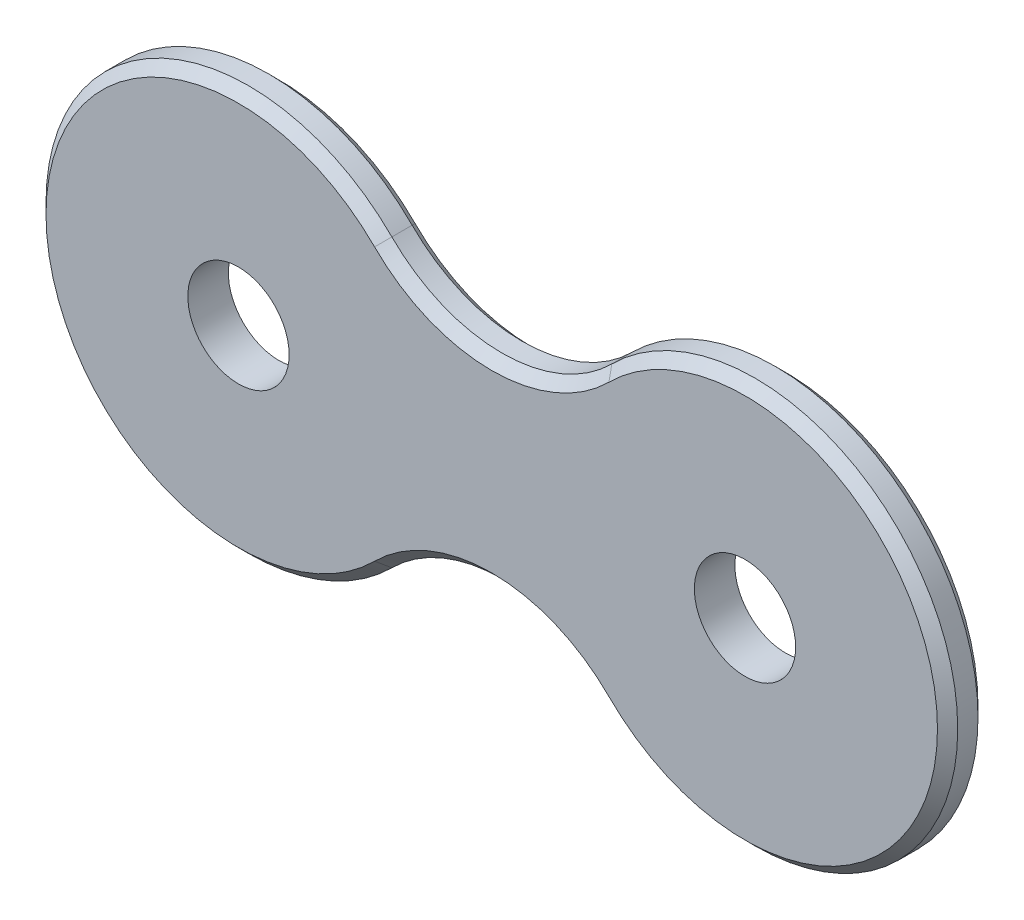
ISO-10303-21;
HEADER;
FILE_DESCRIPTION(('STEP AP214'),'2;1');
FILE_NAME('part.step','',(''),(''),'','','');
FILE_SCHEMA(('AUTOMOTIVE_DESIGN { 1 0 10303 214 1 1 1 1 }'));
ENDSEC;
DATA;
#1=APPLICATION_CONTEXT('core data for automotive mechanical design processes');
#2=APPLICATION_PROTOCOL_DEFINITION('international standard','automotive_design',2000,#1);
#3=PRODUCT_CONTEXT('',#1,'mechanical');
#4=PRODUCT('Part','Part','',(#3));
#5=PRODUCT_RELATED_PRODUCT_CATEGORY('part','',(#4));
#6=PRODUCT_DEFINITION_FORMATION('','',#4);
#7=PRODUCT_DEFINITION_CONTEXT('part definition',#1,'design');
#8=PRODUCT_DEFINITION('design','',#6,#7);
#9=PRODUCT_DEFINITION_SHAPE('','',#8);
#10=(LENGTH_UNIT() NAMED_UNIT(*) SI_UNIT(.MILLI.,.METRE.));
#11=(NAMED_UNIT(*) PLANE_ANGLE_UNIT() SI_UNIT($,.RADIAN.));
#12=(NAMED_UNIT(*) SI_UNIT($,.STERADIAN.) SOLID_ANGLE_UNIT());
#13=UNCERTAINTY_MEASURE_WITH_UNIT(LENGTH_MEASURE(1.E-05),#10,'distance_accuracy_value','');
#14=(GEOMETRIC_REPRESENTATION_CONTEXT(3) GLOBAL_UNCERTAINTY_ASSIGNED_CONTEXT((#13)) GLOBAL_UNIT_ASSIGNED_CONTEXT((#10,
#11,#12)) REPRESENTATION_CONTEXT('',''));
#15=CARTESIAN_POINT('',(0.,0.,0.));
#16=DIRECTION('',(0.,0.,1.));
#17=DIRECTION('',(1.,0.,0.));
#18=AXIS2_PLACEMENT_3D('',#15,#16,#17);
#19=CARTESIAN_POINT('',(18.75,6.25,2.));
#20=DIRECTION('',(0.,0.,1.));
#21=DIRECTION('',(1.,0.,0.));
#22=AXIS2_PLACEMENT_3D('',#19,#20,#21);
#23=PLANE('',#22);
#24=CARTESIAN_POINT('',(12.5,-12.5,2.));
#25=DIRECTION('',(0.,0.,1.));
#26=DIRECTION('',(1.,0.,0.));
#27=AXIS2_PLACEMENT_3D('',#24,#25,#26);
#28=CIRCLE('',#27,8.17766952966369);
#29=CARTESIAN_POINT('',(6.7175144212722,-6.7175144212722,2.));
#30=VERTEX_POINT('',#29);
#31=CARTESIAN_POINT('',(18.2824855787278,-6.7175144212722,2.));
#32=VERTEX_POINT('',#31);
#33=EDGE_CURVE('E72',#30,#32,#28,.F.);
#34=ORIENTED_EDGE('',*,*,#33,.T.);
#35=CARTESIAN_POINT('',(25.,0.,2.));
#36=DIRECTION('',(0.,0.,1.));
#37=DIRECTION('',(1.,0.,0.));
#38=AXIS2_PLACEMENT_3D('',#35,#36,#37);
#39=CIRCLE('',#38,9.49999999999999);
#40=CARTESIAN_POINT('',(18.2824855787278,6.7175144212722,2.));
#41=VERTEX_POINT('',#40);
#42=EDGE_CURVE('E12',#32,#41,#39,.T.);
#43=ORIENTED_EDGE('',*,*,#42,.T.);
#44=CARTESIAN_POINT('',(12.5,12.5,2.));
#45=DIRECTION('',(0.,0.,1.));
#46=DIRECTION('',(1.,0.,0.));
#47=AXIS2_PLACEMENT_3D('',#44,#45,#46);
#48=CIRCLE('',#47,8.17766952966369);
#49=CARTESIAN_POINT('',(6.7175144212722,6.7175144212722,2.));
#50=VERTEX_POINT('',#49);
#51=EDGE_CURVE('E179',#41,#50,#48,.F.);
#52=ORIENTED_EDGE('',*,*,#51,.T.);
#53=CARTESIAN_POINT('',(0.,0.,2.));
#54=DIRECTION('',(0.,0.,1.));
#55=DIRECTION('',(1.,0.,0.));
#56=AXIS2_PLACEMENT_3D('',#53,#54,#55);
#57=CIRCLE('',#56,9.49999999999999);
#58=EDGE_CURVE('E83',#50,#30,#57,.T.);
#59=ORIENTED_EDGE('',*,*,#58,.T.);
#60=EDGE_LOOP('',(#34,#43,#52,#59));
#61=FACE_BOUND('',#60,.T.);
#62=CARTESIAN_POINT('',(0.,0.,2.));
#63=DIRECTION('',(0.,0.,1.));
#64=DIRECTION('',(1.,0.,0.));
#65=AXIS2_PLACEMENT_3D('',#62,#63,#64);
#66=CIRCLE('',#65,2.5);
#67=CARTESIAN_POINT('',(2.5,0.,2.));
#68=VERTEX_POINT('',#67);
#69=EDGE_CURVE('E204',#68,#68,#66,.T.);
#70=ORIENTED_EDGE('',*,*,#69,.F.);
#71=EDGE_LOOP('',(#70));
#72=FACE_BOUND('',#71,.T.);
#73=CARTESIAN_POINT('',(25.,0.,2.));
#74=DIRECTION('',(0.,0.,1.));
#75=DIRECTION('',(1.,0.,0.));
#76=AXIS2_PLACEMENT_3D('',#73,#74,#75);
#77=CIRCLE('',#76,2.5);
#78=CARTESIAN_POINT('',(27.5,0.,2.));
#79=VERTEX_POINT('',#78);
#80=EDGE_CURVE('E215',#79,#79,#77,.T.);
#81=ORIENTED_EDGE('',*,*,#80,.F.);
#82=EDGE_LOOP('',(#81));
#83=FACE_BOUND('',#82,.T.);
#84=ADVANCED_FACE('F63',(#61,#72,#83),#23,.T.);
#85=CARTESIAN_POINT('',(18.75,6.25,0.));
#86=DIRECTION('',(0.,0.,1.));
#87=DIRECTION('',(1.,0.,0.));
#88=AXIS2_PLACEMENT_3D('',#85,#86,#87);
#89=PLANE('',#88);
#90=CARTESIAN_POINT('',(25.,0.,0.));
#91=DIRECTION('',(0.,0.,1.));
#92=DIRECTION('',(1.,0.,0.));
#93=AXIS2_PLACEMENT_3D('',#90,#91,#92);
#94=CIRCLE('',#93,9.5);
#95=CARTESIAN_POINT('',(18.2824855787278,6.71751442127221,0.));
#96=VERTEX_POINT('',#95);
#97=CARTESIAN_POINT('',(18.2824855787278,-6.7175144212722,0.));
#98=VERTEX_POINT('',#97);
#99=EDGE_CURVE('E139',#96,#98,#94,.F.);
#100=ORIENTED_EDGE('',*,*,#99,.T.);
#101=CARTESIAN_POINT('',(12.5,-12.5,0.));
#102=DIRECTION('',(0.,0.,1.));
#103=DIRECTION('',(1.,0.,0.));
#104=AXIS2_PLACEMENT_3D('',#101,#102,#103);
#105=CIRCLE('',#104,8.17766952966369);
#106=CARTESIAN_POINT('',(6.7175144212722,-6.7175144212722,0.));
#107=VERTEX_POINT('',#106);
#108=EDGE_CURVE('E135',#98,#107,#105,.T.);
#109=ORIENTED_EDGE('',*,*,#108,.T.);
#110=CARTESIAN_POINT('',(0.,0.,0.));
#111=DIRECTION('',(0.,0.,1.));
#112=DIRECTION('',(1.,0.,0.));
#113=AXIS2_PLACEMENT_3D('',#110,#111,#112);
#114=CIRCLE('',#113,9.5);
#115=CARTESIAN_POINT('',(6.7175144212722,6.7175144212722,0.));
#116=VERTEX_POINT('',#115);
#117=EDGE_CURVE('E128',#107,#116,#114,.F.);
#118=ORIENTED_EDGE('',*,*,#117,.T.);
#119=CARTESIAN_POINT('',(12.5,12.5,0.));
#120=DIRECTION('',(0.,0.,1.));
#121=DIRECTION('',(1.,0.,0.));
#122=AXIS2_PLACEMENT_3D('',#119,#120,#121);
#123=CIRCLE('',#122,8.17766952966369);
#124=EDGE_CURVE('E132',#116,#96,#123,.T.);
#125=ORIENTED_EDGE('',*,*,#124,.T.);
#126=EDGE_LOOP('',(#100,#109,#118,#125));
#127=FACE_BOUND('',#126,.T.);
#128=CARTESIAN_POINT('',(0.,0.,0.));
#129=DIRECTION('',(0.,0.,1.));
#130=DIRECTION('',(1.,0.,0.));
#131=AXIS2_PLACEMENT_3D('',#128,#129,#130);
#132=CIRCLE('',#131,2.5);
#133=CARTESIAN_POINT('',(2.5,0.,0.));
#134=VERTEX_POINT('',#133);
#135=EDGE_CURVE('E212',#134,#134,#132,.T.);
#136=ORIENTED_EDGE('',*,*,#135,.T.);
#137=EDGE_LOOP('',(#136));
#138=FACE_BOUND('',#137,.T.);
#139=CARTESIAN_POINT('',(25.,0.,0.));
#140=DIRECTION('',(0.,0.,1.));
#141=DIRECTION('',(1.,0.,0.));
#142=AXIS2_PLACEMENT_3D('',#139,#140,#141);
#143=CIRCLE('',#142,2.5);
#144=CARTESIAN_POINT('',(27.5,0.,0.));
#145=VERTEX_POINT('',#144);
#146=EDGE_CURVE('E156',#145,#145,#143,.T.);
#147=ORIENTED_EDGE('',*,*,#146,.T.);
#148=EDGE_LOOP('',(#147));
#149=FACE_BOUND('',#148,.T.);
#150=ADVANCED_FACE('F130',(#127,#138,#149),#89,.F.);
#151=CARTESIAN_POINT('',(12.5,12.5,2.));
#152=DIRECTION('',(0.,0.,-1.));
#153=DIRECTION('',(-1.,0.,0.));
#154=AXIS2_PLACEMENT_3D('',#151,#152,#153);
#155=CYLINDRICAL_SURFACE('',#154,7.67766952966369);
#156=DIRECTION('',(0.,0.,-1.));
#157=VECTOR('',#156,1.);
#158=CARTESIAN_POINT('',(17.9289321881345,7.07106781186548,2.));
#159=LINE('',#158,#157);
#160=CARTESIAN_POINT('',(17.9289321881345,7.07106781186548,1.5));
#161=VERTEX_POINT('',#160);
#162=CARTESIAN_POINT('',(17.9289321881345,7.07106781186548,0.5));
#163=VERTEX_POINT('',#162);
#164=EDGE_CURVE('E200',#161,#163,#159,.T.);
#165=ORIENTED_EDGE('',*,*,#164,.T.);
#166=CARTESIAN_POINT('',(12.5,12.5,0.5));
#167=DIRECTION('',(0.,0.,1.));
#168=DIRECTION('',(1.,0.,0.));
#169=AXIS2_PLACEMENT_3D('',#166,#167,#168);
#170=CIRCLE('',#169,7.67766952966369);
#171=CARTESIAN_POINT('',(7.07106781186547,7.07106781186547,0.5));
#172=VERTEX_POINT('',#171);
#173=EDGE_CURVE('E181',#163,#172,#170,.F.);
#174=ORIENTED_EDGE('',*,*,#173,.T.);
#175=DIRECTION('',(0.,0.,-1.));
#176=VECTOR('',#175,1.);
#177=CARTESIAN_POINT('',(7.07106781186547,7.07106781186547,2.));
#178=LINE('',#177,#176);
#179=CARTESIAN_POINT('',(7.07106781186547,7.07106781186547,1.5));
#180=VERTEX_POINT('',#179);
#181=EDGE_CURVE('E150',#180,#172,#178,.T.);
#182=ORIENTED_EDGE('',*,*,#181,.F.);
#183=CARTESIAN_POINT('',(12.5,12.5,1.5));
#184=DIRECTION('',(0.,0.,1.));
#185=DIRECTION('',(1.,0.,0.));
#186=AXIS2_PLACEMENT_3D('',#183,#184,#185);
#187=CIRCLE('',#186,7.67766952966369);
#188=EDGE_CURVE('E183',#180,#161,#187,.T.);
#189=ORIENTED_EDGE('',*,*,#188,.T.);
#190=EDGE_LOOP('',(#165,#174,#182,#189));
#191=FACE_BOUND('',#190,.T.);
#192=ADVANCED_FACE('F231',(#191),#155,.F.);
#193=CARTESIAN_POINT('',(0.,0.,2.));
#194=DIRECTION('',(0.,0.,-1.));
#195=DIRECTION('',(-1.,0.,0.));
#196=AXIS2_PLACEMENT_3D('',#193,#194,#195);
#197=CYLINDRICAL_SURFACE('',#196,10.);
#198=ORIENTED_EDGE('',*,*,#181,.T.);
#199=CARTESIAN_POINT('',(0.,0.,0.5));
#200=DIRECTION('',(0.,0.,1.));
#201=DIRECTION('',(1.,0.,0.));
#202=AXIS2_PLACEMENT_3D('',#199,#200,#201);
#203=CIRCLE('',#202,10.);
#204=CARTESIAN_POINT('',(7.07106781186547,-7.07106781186548,0.5));
#205=VERTEX_POINT('',#204);
#206=EDGE_CURVE('E153',#172,#205,#203,.T.);
#207=ORIENTED_EDGE('',*,*,#206,.T.);
#208=DIRECTION('',(0.,0.,-1.));
#209=VECTOR('',#208,1.);
#210=CARTESIAN_POINT('',(7.07106781186547,-7.07106781186548,2.));
#211=LINE('',#210,#209);
#212=CARTESIAN_POINT('',(7.07106781186547,-7.07106781186548,1.5));
#213=VERTEX_POINT('',#212);
#214=EDGE_CURVE('E207',#213,#205,#211,.T.);
#215=ORIENTED_EDGE('',*,*,#214,.F.);
#216=CARTESIAN_POINT('',(0.,0.,1.5));
#217=DIRECTION('',(0.,0.,1.));
#218=DIRECTION('',(1.,0.,0.));
#219=AXIS2_PLACEMENT_3D('',#216,#217,#218);
#220=CIRCLE('',#219,10.);
#221=EDGE_CURVE('E191',#213,#180,#220,.F.);
#222=ORIENTED_EDGE('',*,*,#221,.T.);
#223=EDGE_LOOP('',(#198,#207,#215,#222));
#224=FACE_BOUND('',#223,.T.);
#225=ADVANCED_FACE('F238',(#224),#197,.T.);
#226=CARTESIAN_POINT('',(12.5,-12.5,2.));
#227=DIRECTION('',(0.,0.,-1.));
#228=DIRECTION('',(-1.,0.,0.));
#229=AXIS2_PLACEMENT_3D('',#226,#227,#228);
#230=CYLINDRICAL_SURFACE('',#229,7.67766952966369);
#231=ORIENTED_EDGE('',*,*,#214,.T.);
#232=CARTESIAN_POINT('',(12.5,-12.5,0.5));
#233=DIRECTION('',(0.,0.,1.));
#234=DIRECTION('',(1.,0.,0.));
#235=AXIS2_PLACEMENT_3D('',#232,#233,#234);
#236=CIRCLE('',#235,7.67766952966369);
#237=CARTESIAN_POINT('',(17.9289321881345,-7.07106781186547,0.5));
#238=VERTEX_POINT('',#237);
#239=EDGE_CURVE('E193',#205,#238,#236,.F.);
#240=ORIENTED_EDGE('',*,*,#239,.T.);
#241=DIRECTION('',(0.,0.,-1.));
#242=VECTOR('',#241,1.);
#243=CARTESIAN_POINT('',(17.9289321881345,-7.07106781186547,2.));
#244=LINE('',#243,#242);
#245=CARTESIAN_POINT('',(17.9289321881345,-7.07106781186547,1.5));
#246=VERTEX_POINT('',#245);
#247=EDGE_CURVE('E203',#246,#238,#244,.T.);
#248=ORIENTED_EDGE('',*,*,#247,.F.);
#249=CARTESIAN_POINT('',(12.5,-12.5,1.5));
#250=DIRECTION('',(0.,0.,1.));
#251=DIRECTION('',(1.,0.,0.));
#252=AXIS2_PLACEMENT_3D('',#249,#250,#251);
#253=CIRCLE('',#252,7.67766952966369);
#254=EDGE_CURVE('E196',#246,#213,#253,.T.);
#255=ORIENTED_EDGE('',*,*,#254,.T.);
#256=EDGE_LOOP('',(#231,#240,#248,#255));
#257=FACE_BOUND('',#256,.T.);
#258=ADVANCED_FACE('F241',(#257),#230,.F.);
#259=CARTESIAN_POINT('',(25.,0.,2.));
#260=DIRECTION('',(0.,0.,-1.));
#261=DIRECTION('',(-1.,0.,0.));
#262=AXIS2_PLACEMENT_3D('',#259,#260,#261);
#263=CYLINDRICAL_SURFACE('',#262,10.);
#264=ORIENTED_EDGE('',*,*,#247,.T.);
#265=CARTESIAN_POINT('',(25.,0.,0.5));
#266=DIRECTION('',(0.,0.,1.));
#267=DIRECTION('',(1.,0.,0.));
#268=AXIS2_PLACEMENT_3D('',#265,#266,#267);
#269=CIRCLE('',#268,10.);
#270=EDGE_CURVE('E185',#238,#163,#269,.T.);
#271=ORIENTED_EDGE('',*,*,#270,.T.);
#272=ORIENTED_EDGE('',*,*,#164,.F.);
#273=CARTESIAN_POINT('',(25.,0.,1.5));
#274=DIRECTION('',(0.,0.,1.));
#275=DIRECTION('',(1.,0.,0.));
#276=AXIS2_PLACEMENT_3D('',#273,#274,#275);
#277=CIRCLE('',#276,10.);
#278=EDGE_CURVE('E187',#161,#246,#277,.F.);
#279=ORIENTED_EDGE('',*,*,#278,.T.);
#280=EDGE_LOOP('',(#264,#271,#272,#279));
#281=FACE_BOUND('',#280,.T.);
#282=ADVANCED_FACE('F245',(#281),#263,.T.);
#283=CARTESIAN_POINT('',(0.,0.,2.));
#284=DIRECTION('',(0.,0.,-1.));
#285=DIRECTION('',(-1.,0.,0.));
#286=AXIS2_PLACEMENT_3D('',#283,#284,#285);
#287=CYLINDRICAL_SURFACE('',#286,2.5);
#288=ORIENTED_EDGE('',*,*,#69,.T.);
#289=EDGE_LOOP('',(#288));
#290=FACE_BOUND('',#289,.T.);
#291=ORIENTED_EDGE('',*,*,#135,.F.);
#292=EDGE_LOOP('',(#291));
#293=FACE_BOUND('',#292,.T.);
#294=ADVANCED_FACE('F235',(#290,#293),#287,.F.);
#295=CARTESIAN_POINT('',(25.,0.,2.));
#296=DIRECTION('',(0.,0.,-1.));
#297=DIRECTION('',(-1.,0.,0.));
#298=AXIS2_PLACEMENT_3D('',#295,#296,#297);
#299=CYLINDRICAL_SURFACE('',#298,2.5);
#300=ORIENTED_EDGE('',*,*,#80,.T.);
#301=EDGE_LOOP('',(#300));
#302=FACE_BOUND('',#301,.T.);
#303=ORIENTED_EDGE('',*,*,#146,.F.);
#304=EDGE_LOOP('',(#303));
#305=FACE_BOUND('',#304,.T.);
#306=ADVANCED_FACE('F223',(#302,#305),#299,.F.);
#307=CARTESIAN_POINT('',(12.5,12.5,0.));
#308=DIRECTION('',(0.,0.,-1.));
#309=DIRECTION('',(-1.,0.,0.));
#310=AXIS2_PLACEMENT_3D('',#307,#308,#309);
#311=CONICAL_SURFACE('',#310,8.17766952966369,0.785398163397451);
#312=DIRECTION('',(-0.500000000000001,-0.500000000000001,-0.707106781186546));
#313=VECTOR('',#312,1.);
#314=CARTESIAN_POINT('',(7.07106781186547,7.07106781186547,0.5));
#315=LINE('',#314,#313);
#316=EDGE_CURVE('E145',#172,#116,#315,.T.);
#317=ORIENTED_EDGE('',*,*,#316,.F.);
#318=ORIENTED_EDGE('',*,*,#173,.F.);
#319=DIRECTION('',(-0.500000000000001,0.500000000000001,0.707106781186546));
#320=VECTOR('',#319,1.);
#321=CARTESIAN_POINT('',(18.2824855787278,6.71751442127221,0.));
#322=LINE('',#321,#320);
#323=EDGE_CURVE('E148',#96,#163,#322,.T.);
#324=ORIENTED_EDGE('',*,*,#323,.F.);
#325=ORIENTED_EDGE('',*,*,#124,.F.);
#326=EDGE_LOOP('',(#317,#318,#324,#325));
#327=FACE_BOUND('',#326,.T.);
#328=ADVANCED_FACE('F143',(#327),#311,.F.);
#329=CARTESIAN_POINT('',(25.,0.,0.5));
#330=DIRECTION('',(0.,0.,1.));
#331=DIRECTION('',(1.,0.,0.));
#332=AXIS2_PLACEMENT_3D('',#329,#330,#331);
#333=CONICAL_SURFACE('',#332,10.,0.78539816339745);
#334=ORIENTED_EDGE('',*,*,#323,.T.);
#335=ORIENTED_EDGE('',*,*,#270,.F.);
#336=DIRECTION('',(-0.500000000000002,-0.5,0.707106781186546));
#337=VECTOR('',#336,1.);
#338=CARTESIAN_POINT('',(18.2824855787278,-6.7175144212722,0.));
#339=LINE('',#338,#337);
#340=EDGE_CURVE('E154',#98,#238,#339,.T.);
#341=ORIENTED_EDGE('',*,*,#340,.F.);
#342=ORIENTED_EDGE('',*,*,#99,.F.);
#343=EDGE_LOOP('',(#334,#335,#341,#342));
#344=FACE_BOUND('',#343,.T.);
#345=ADVANCED_FACE('F258',(#344),#333,.T.);
#346=CARTESIAN_POINT('',(0.,0.,0.5));
#347=DIRECTION('',(0.,0.,1.));
#348=DIRECTION('',(1.,0.,0.));
#349=AXIS2_PLACEMENT_3D('',#346,#347,#348);
#350=CONICAL_SURFACE('',#349,10.,0.78539816339745);
#351=ORIENTED_EDGE('',*,*,#316,.T.);
#352=ORIENTED_EDGE('',*,*,#117,.F.);
#353=DIRECTION('',(-0.500000000000001,0.500000000000001,-0.707106781186546));
#354=VECTOR('',#353,1.);
#355=CARTESIAN_POINT('',(7.07106781186547,-7.07106781186548,0.5));
#356=LINE('',#355,#354);
#357=EDGE_CURVE('E158',#205,#107,#356,.T.);
#358=ORIENTED_EDGE('',*,*,#357,.F.);
#359=ORIENTED_EDGE('',*,*,#206,.F.);
#360=EDGE_LOOP('',(#351,#352,#358,#359));
#361=FACE_BOUND('',#360,.T.);
#362=ADVANCED_FACE('F152',(#361),#350,.T.);
#363=CARTESIAN_POINT('',(12.5,-12.5,0.));
#364=DIRECTION('',(0.,0.,-1.));
#365=DIRECTION('',(-1.,0.,0.));
#366=AXIS2_PLACEMENT_3D('',#363,#364,#365);
#367=CONICAL_SURFACE('',#366,8.17766952966369,0.785398163397451);
#368=ORIENTED_EDGE('',*,*,#340,.T.);
#369=ORIENTED_EDGE('',*,*,#239,.F.);
#370=ORIENTED_EDGE('',*,*,#357,.T.);
#371=ORIENTED_EDGE('',*,*,#108,.F.);
#372=EDGE_LOOP('',(#368,#369,#370,#371));
#373=FACE_BOUND('',#372,.T.);
#374=ADVANCED_FACE('F253',(#373),#367,.F.);
#375=CARTESIAN_POINT('',(0.,0.,2.));
#376=DIRECTION('',(0.,0.,-1.));
#377=DIRECTION('',(-1.,0.,0.));
#378=AXIS2_PLACEMENT_3D('',#375,#376,#377);
#379=CONICAL_SURFACE('',#378,9.49999999999999,0.785398163397451);
#380=DIRECTION('',(-0.500000000000002,-0.500000000000002,0.707106781186545));
#381=VECTOR('',#380,1.);
#382=CARTESIAN_POINT('',(7.07106781186547,7.07106781186547,1.5));
#383=LINE('',#382,#381);
#384=EDGE_CURVE('E165',#180,#50,#383,.T.);
#385=ORIENTED_EDGE('',*,*,#384,.F.);
#386=ORIENTED_EDGE('',*,*,#221,.F.);
#387=DIRECTION('',(0.500000000000002,-0.500000000000002,-0.707106781186545));
#388=VECTOR('',#387,1.);
#389=CARTESIAN_POINT('',(6.7175144212722,-6.7175144212722,2.));
#390=LINE('',#389,#388);
#391=EDGE_CURVE('E67',#30,#213,#390,.T.);
#392=ORIENTED_EDGE('',*,*,#391,.F.);
#393=ORIENTED_EDGE('',*,*,#58,.F.);
#394=EDGE_LOOP('',(#385,#386,#392,#393));
#395=FACE_BOUND('',#394,.T.);
#396=ADVANCED_FACE('F65',(#395),#379,.T.);
#397=CARTESIAN_POINT('',(12.5,-12.5,1.5));
#398=DIRECTION('',(0.,0.,1.));
#399=DIRECTION('',(1.,0.,0.));
#400=AXIS2_PLACEMENT_3D('',#397,#398,#399);
#401=CONICAL_SURFACE('',#400,7.67766952966369,0.78539816339745);
#402=ORIENTED_EDGE('',*,*,#391,.T.);
#403=ORIENTED_EDGE('',*,*,#254,.F.);
#404=DIRECTION('',(-0.500000000000001,-0.500000000000001,-0.707106781186546));
#405=VECTOR('',#404,1.);
#406=CARTESIAN_POINT('',(18.2824855787278,-6.7175144212722,2.));
#407=LINE('',#406,#405);
#408=EDGE_CURVE('E164',#32,#246,#407,.T.);
#409=ORIENTED_EDGE('',*,*,#408,.F.);
#410=ORIENTED_EDGE('',*,*,#33,.F.);
#411=EDGE_LOOP('',(#402,#403,#409,#410));
#412=FACE_BOUND('',#411,.T.);
#413=ADVANCED_FACE('F270',(#412),#401,.F.);
#414=CARTESIAN_POINT('',(12.5,12.5,1.5));
#415=DIRECTION('',(0.,0.,1.));
#416=DIRECTION('',(1.,0.,0.));
#417=AXIS2_PLACEMENT_3D('',#414,#415,#416);
#418=CONICAL_SURFACE('',#417,7.67766952966369,0.78539816339745);
#419=ORIENTED_EDGE('',*,*,#384,.T.);
#420=ORIENTED_EDGE('',*,*,#51,.F.);
#421=DIRECTION('',(0.500000000000001,-0.500000000000002,0.707106781186546));
#422=VECTOR('',#421,1.);
#423=CARTESIAN_POINT('',(17.9289321881345,7.07106781186548,1.5));
#424=LINE('',#423,#422);
#425=EDGE_CURVE('E162',#161,#41,#424,.T.);
#426=ORIENTED_EDGE('',*,*,#425,.F.);
#427=ORIENTED_EDGE('',*,*,#188,.F.);
#428=EDGE_LOOP('',(#419,#420,#426,#427));
#429=FACE_BOUND('',#428,.T.);
#430=ADVANCED_FACE('F267',(#429),#418,.F.);
#431=CARTESIAN_POINT('',(25.,0.,2.));
#432=DIRECTION('',(0.,0.,-1.));
#433=DIRECTION('',(-1.,0.,0.));
#434=AXIS2_PLACEMENT_3D('',#431,#432,#433);
#435=CONICAL_SURFACE('',#434,9.49999999999999,0.785398163397451);
#436=ORIENTED_EDGE('',*,*,#408,.T.);
#437=ORIENTED_EDGE('',*,*,#278,.F.);
#438=ORIENTED_EDGE('',*,*,#425,.T.);
#439=ORIENTED_EDGE('',*,*,#42,.F.);
#440=EDGE_LOOP('',(#436,#437,#438,#439));
#441=FACE_BOUND('',#440,.T.);
#442=ADVANCED_FACE('F264',(#441),#435,.T.);
#443=CLOSED_SHELL('',(#84,#150,#192,#225,#258,#282,#294,#306,#328,#345,#362,#374,#396,#413,#430,#442));
#444=MANIFOLD_SOLID_BREP('B2',#443);
#445=ADVANCED_BREP_SHAPE_REPRESENTATION('',(#18,#444),#14);
#446=SHAPE_DEFINITION_REPRESENTATION(#9,#445);
ENDSEC;
END-ISO-10303-21;
